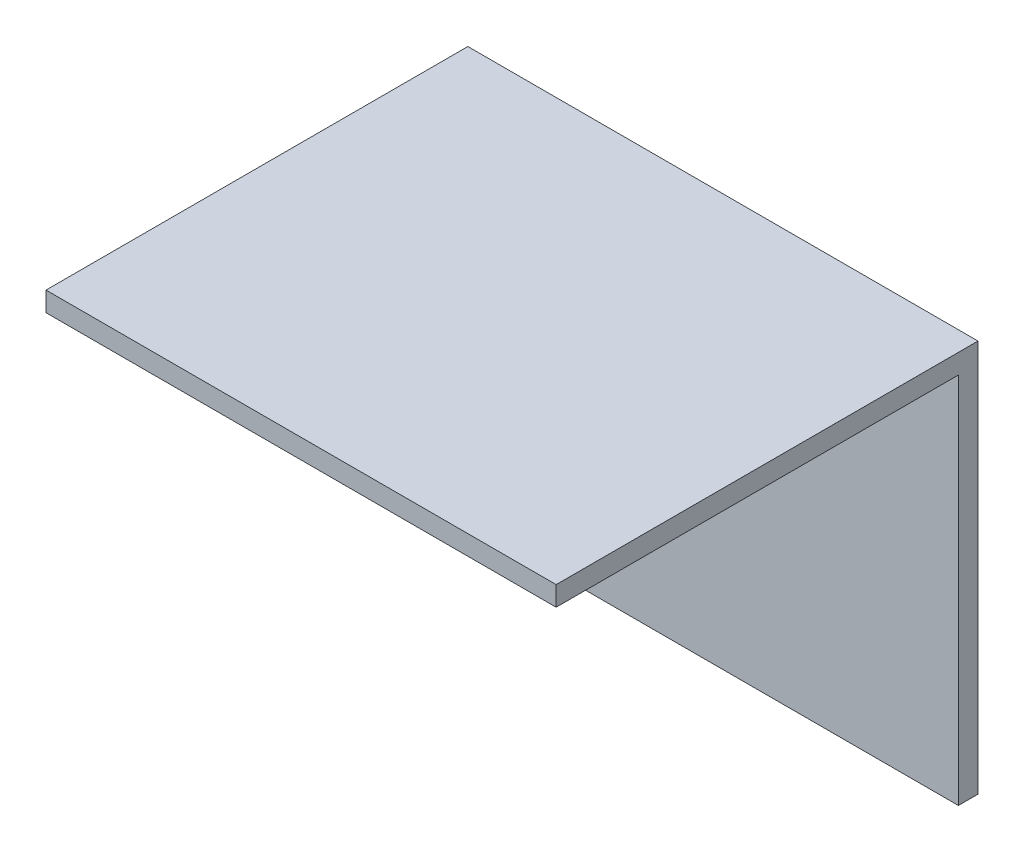
ISO-10303-21;
HEADER;
FILE_DESCRIPTION(('STEP AP214'),'2;1');
FILE_NAME('part.step','',(''),(''),'','','');
FILE_SCHEMA(('AUTOMOTIVE_DESIGN { 1 0 10303 214 1 1 1 1 }'));
ENDSEC;
DATA;
#1=APPLICATION_CONTEXT('core data for automotive mechanical design processes');
#2=APPLICATION_PROTOCOL_DEFINITION('international standard','automotive_design',2000,#1);
#3=PRODUCT_CONTEXT('',#1,'mechanical');
#4=PRODUCT('Part','Part','',(#3));
#5=PRODUCT_RELATED_PRODUCT_CATEGORY('part','',(#4));
#6=PRODUCT_DEFINITION_FORMATION('','',#4);
#7=PRODUCT_DEFINITION_CONTEXT('part definition',#1,'design');
#8=PRODUCT_DEFINITION('design','',#6,#7);
#9=PRODUCT_DEFINITION_SHAPE('','',#8);
#10=(LENGTH_UNIT() NAMED_UNIT(*) SI_UNIT(.MILLI.,.METRE.));
#11=(NAMED_UNIT(*) PLANE_ANGLE_UNIT() SI_UNIT($,.RADIAN.));
#12=(NAMED_UNIT(*) SI_UNIT($,.STERADIAN.) SOLID_ANGLE_UNIT());
#13=UNCERTAINTY_MEASURE_WITH_UNIT(LENGTH_MEASURE(1.E-05),#10,'distance_accuracy_value','');
#14=(GEOMETRIC_REPRESENTATION_CONTEXT(3) GLOBAL_UNCERTAINTY_ASSIGNED_CONTEXT((#13)) GLOBAL_UNIT_ASSIGNED_CONTEXT((#10,
#11,#12)) REPRESENTATION_CONTEXT('',''));
#15=CARTESIAN_POINT('',(0.,0.,0.));
#16=DIRECTION('',(0.,0.,1.));
#17=DIRECTION('',(1.,0.,0.));
#18=AXIS2_PLACEMENT_3D('',#15,#16,#17);
#19=CARTESIAN_POINT('',(26.,-20.,43.));
#20=DIRECTION('',(-1.,0.,0.));
#21=DIRECTION('',(0.,0.,1.));
#22=AXIS2_PLACEMENT_3D('',#19,#20,#21);
#23=PLANE('',#22);
#24=DIRECTION('',(0.,1.,0.));
#25=VECTOR('',#24,1.);
#26=CARTESIAN_POINT('',(26.,-20.,43.));
#27=LINE('',#26,#25);
#28=CARTESIAN_POINT('',(26.,18.,43.));
#29=VERTEX_POINT('',#28);
#30=CARTESIAN_POINT('',(26.,20.,43.));
#31=VERTEX_POINT('',#30);
#32=EDGE_CURVE('E91',#29,#31,#27,.T.);
#33=ORIENTED_EDGE('',*,*,#32,.F.);
#34=DIRECTION('',(0.,0.,-1.));
#35=VECTOR('',#34,1.);
#36=CARTESIAN_POINT('',(26.,18.,43.));
#37=LINE('',#36,#35);
#38=CARTESIAN_POINT('',(26.,18.,2.));
#39=VERTEX_POINT('',#38);
#40=EDGE_CURVE('E115',#29,#39,#37,.T.);
#41=ORIENTED_EDGE('',*,*,#40,.T.);
#42=DIRECTION('',(0.,-1.,0.));
#43=VECTOR('',#42,1.);
#44=CARTESIAN_POINT('',(26.,-20.,2.));
#45=LINE('',#44,#43);
#46=CARTESIAN_POINT('',(26.,-20.,2.));
#47=VERTEX_POINT('',#46);
#48=EDGE_CURVE('E83',#39,#47,#45,.T.);
#49=ORIENTED_EDGE('',*,*,#48,.T.);
#50=DIRECTION('',(0.,0.,-1.));
#51=VECTOR('',#50,1.);
#52=CARTESIAN_POINT('',(26.,-20.,43.));
#53=LINE('',#52,#51);
#54=CARTESIAN_POINT('',(26.,-20.,0.));
#55=VERTEX_POINT('',#54);
#56=EDGE_CURVE('E75',#47,#55,#53,.T.);
#57=ORIENTED_EDGE('',*,*,#56,.T.);
#58=DIRECTION('',(0.,1.,0.));
#59=VECTOR('',#58,1.);
#60=CARTESIAN_POINT('',(26.,-20.,0.));
#61=LINE('',#60,#59);
#62=CARTESIAN_POINT('',(26.,20.,0.));
#63=VERTEX_POINT('',#62);
#64=EDGE_CURVE('E79',#55,#63,#61,.T.);
#65=ORIENTED_EDGE('',*,*,#64,.T.);
#66=DIRECTION('',(0.,0.,-1.));
#67=VECTOR('',#66,1.);
#68=CARTESIAN_POINT('',(26.,20.,43.));
#69=LINE('',#68,#67);
#70=EDGE_CURVE('E43',#31,#63,#69,.T.);
#71=ORIENTED_EDGE('',*,*,#70,.F.);
#72=EDGE_LOOP('',(#33,#41,#49,#57,#65,#71));
#73=FACE_BOUND('',#72,.T.);
#74=ADVANCED_FACE('F35',(#73),#23,.F.);
#75=CARTESIAN_POINT('',(-26.,20.,43.));
#76=DIRECTION('',(0.,-1.,0.));
#77=DIRECTION('',(0.,0.,-1.));
#78=AXIS2_PLACEMENT_3D('',#75,#76,#77);
#79=PLANE('',#78);
#80=DIRECTION('',(-1.,0.,0.));
#81=VECTOR('',#80,1.);
#82=CARTESIAN_POINT('',(-26.,20.,0.));
#83=LINE('',#82,#81);
#84=CARTESIAN_POINT('',(-26.,20.,0.));
#85=VERTEX_POINT('',#84);
#86=EDGE_CURVE('E95',#63,#85,#83,.T.);
#87=ORIENTED_EDGE('',*,*,#86,.T.);
#88=DIRECTION('',(0.,0.,-1.));
#89=VECTOR('',#88,1.);
#90=CARTESIAN_POINT('',(-26.,20.,43.));
#91=LINE('',#90,#89);
#92=CARTESIAN_POINT('',(-26.,20.,43.));
#93=VERTEX_POINT('',#92);
#94=EDGE_CURVE('E108',#93,#85,#91,.T.);
#95=ORIENTED_EDGE('',*,*,#94,.F.);
#96=DIRECTION('',(-1.,0.,0.));
#97=VECTOR('',#96,1.);
#98=CARTESIAN_POINT('',(-26.,20.,43.));
#99=LINE('',#98,#97);
#100=EDGE_CURVE('E51',#31,#93,#99,.T.);
#101=ORIENTED_EDGE('',*,*,#100,.F.);
#102=ORIENTED_EDGE('',*,*,#70,.T.);
#103=EDGE_LOOP('',(#87,#95,#101,#102));
#104=FACE_BOUND('',#103,.T.);
#105=ADVANCED_FACE('F111',(#104),#79,.F.);
#106=CARTESIAN_POINT('',(-26.,-20.,43.));
#107=DIRECTION('',(1.,0.,0.));
#108=DIRECTION('',(0.,0.,-1.));
#109=AXIS2_PLACEMENT_3D('',#106,#107,#108);
#110=PLANE('',#109);
#111=DIRECTION('',(0.,0.,-1.));
#112=VECTOR('',#111,1.);
#113=CARTESIAN_POINT('',(-26.,-20.,43.));
#114=LINE('',#113,#112);
#115=CARTESIAN_POINT('',(-26.,-20.,2.));
#116=VERTEX_POINT('',#115);
#117=CARTESIAN_POINT('',(-26.,-20.,0.));
#118=VERTEX_POINT('',#117);
#119=EDGE_CURVE('E68',#116,#118,#114,.T.);
#120=ORIENTED_EDGE('',*,*,#119,.F.);
#121=DIRECTION('',(0.,-1.,0.));
#122=VECTOR('',#121,1.);
#123=CARTESIAN_POINT('',(-26.,18.,2.));
#124=LINE('',#123,#122);
#125=CARTESIAN_POINT('',(-26.,18.,2.));
#126=VERTEX_POINT('',#125);
#127=EDGE_CURVE('E122',#126,#116,#124,.T.);
#128=ORIENTED_EDGE('',*,*,#127,.F.);
#129=DIRECTION('',(0.,0.,-1.));
#130=VECTOR('',#129,1.);
#131=CARTESIAN_POINT('',(-26.,18.,50.2220480122162));
#132=LINE('',#131,#130);
#133=CARTESIAN_POINT('',(-26.,18.,43.));
#134=VERTEX_POINT('',#133);
#135=EDGE_CURVE('E101',#134,#126,#132,.T.);
#136=ORIENTED_EDGE('',*,*,#135,.F.);
#137=DIRECTION('',(0.,-1.,0.));
#138=VECTOR('',#137,1.);
#139=CARTESIAN_POINT('',(-26.,-20.,43.));
#140=LINE('',#139,#138);
#141=EDGE_CURVE('E84',#93,#134,#140,.T.);
#142=ORIENTED_EDGE('',*,*,#141,.F.);
#143=ORIENTED_EDGE('',*,*,#94,.T.);
#144=DIRECTION('',(0.,-1.,0.));
#145=VECTOR('',#144,1.);
#146=CARTESIAN_POINT('',(-26.,-20.,0.));
#147=LINE('',#146,#145);
#148=EDGE_CURVE('E92',#85,#118,#147,.T.);
#149=ORIENTED_EDGE('',*,*,#148,.T.);
#150=EDGE_LOOP('',(#120,#128,#136,#142,#143,#149));
#151=FACE_BOUND('',#150,.T.);
#152=ADVANCED_FACE('F136',(#151),#110,.F.);
#153=CARTESIAN_POINT('',(-26.,-20.,43.));
#154=DIRECTION('',(0.,1.,0.));
#155=DIRECTION('',(0.,0.,1.));
#156=AXIS2_PLACEMENT_3D('',#153,#154,#155);
#157=PLANE('',#156);
#158=ORIENTED_EDGE('',*,*,#56,.F.);
#159=DIRECTION('',(1.,0.,0.));
#160=VECTOR('',#159,1.);
#161=CARTESIAN_POINT('',(-34.6851779686972,-20.,2.));
#162=LINE('',#161,#160);
#163=EDGE_CURVE('E127',#116,#47,#162,.T.);
#164=ORIENTED_EDGE('',*,*,#163,.F.);
#165=ORIENTED_EDGE('',*,*,#119,.T.);
#166=DIRECTION('',(1.,0.,0.));
#167=VECTOR('',#166,1.);
#168=CARTESIAN_POINT('',(-26.,-20.,0.));
#169=LINE('',#168,#167);
#170=EDGE_CURVE('E87',#118,#55,#169,.T.);
#171=ORIENTED_EDGE('',*,*,#170,.T.);
#172=EDGE_LOOP('',(#158,#164,#165,#171));
#173=FACE_BOUND('',#172,.T.);
#174=ADVANCED_FACE('F88',(#173),#157,.F.);
#175=CARTESIAN_POINT('',(0.,0.,43.));
#176=DIRECTION('',(0.,0.,-1.));
#177=DIRECTION('',(-1.,0.,0.));
#178=AXIS2_PLACEMENT_3D('',#175,#176,#177);
#179=PLANE('',#178);
#180=DIRECTION('',(1.,0.,0.));
#181=VECTOR('',#180,1.);
#182=CARTESIAN_POINT('',(0.,18.,43.));
#183=LINE('',#182,#181);
#184=EDGE_CURVE('E11',#134,#29,#183,.T.);
#185=ORIENTED_EDGE('',*,*,#184,.T.);
#186=ORIENTED_EDGE('',*,*,#32,.T.);
#187=ORIENTED_EDGE('',*,*,#100,.T.);
#188=ORIENTED_EDGE('',*,*,#141,.T.);
#189=EDGE_LOOP('',(#185,#186,#187,#188));
#190=FACE_BOUND('',#189,.T.);
#191=ADVANCED_FACE('F139',(#190),#179,.F.);
#192=CARTESIAN_POINT('',(0.,0.,0.));
#193=DIRECTION('',(0.,0.,-1.));
#194=DIRECTION('',(-1.,0.,0.));
#195=AXIS2_PLACEMENT_3D('',#192,#193,#194);
#196=PLANE('',#195);
#197=ORIENTED_EDGE('',*,*,#64,.F.);
#198=ORIENTED_EDGE('',*,*,#170,.F.);
#199=ORIENTED_EDGE('',*,*,#148,.F.);
#200=ORIENTED_EDGE('',*,*,#86,.F.);
#201=EDGE_LOOP('',(#197,#198,#199,#200));
#202=FACE_BOUND('',#201,.T.);
#203=ADVANCED_FACE('F94',(#202),#196,.T.);
#204=CARTESIAN_POINT('',(24.,18.,50.2220480122162));
#205=DIRECTION('',(0.,1.,0.));
#206=DIRECTION('',(0.,0.,1.));
#207=AXIS2_PLACEMENT_3D('',#204,#205,#206);
#208=PLANE('',#207);
#209=ORIENTED_EDGE('',*,*,#135,.T.);
#210=DIRECTION('',(-1.,0.,0.));
#211=VECTOR('',#210,1.);
#212=CARTESIAN_POINT('',(24.,18.,2.));
#213=LINE('',#212,#211);
#214=EDGE_CURVE('E97',#39,#126,#213,.T.);
#215=ORIENTED_EDGE('',*,*,#214,.F.);
#216=ORIENTED_EDGE('',*,*,#40,.F.);
#217=ORIENTED_EDGE('',*,*,#184,.F.);
#218=EDGE_LOOP('',(#209,#215,#216,#217));
#219=FACE_BOUND('',#218,.T.);
#220=ADVANCED_FACE('F145',(#219),#208,.F.);
#221=CARTESIAN_POINT('',(24.,18.,2.));
#222=DIRECTION('',(0.,0.,-1.));
#223=DIRECTION('',(-1.,0.,0.));
#224=AXIS2_PLACEMENT_3D('',#221,#222,#223);
#225=PLANE('',#224);
#226=ORIENTED_EDGE('',*,*,#127,.T.);
#227=ORIENTED_EDGE('',*,*,#163,.T.);
#228=ORIENTED_EDGE('',*,*,#48,.F.);
#229=ORIENTED_EDGE('',*,*,#214,.T.);
#230=EDGE_LOOP('',(#226,#227,#228,#229));
#231=FACE_BOUND('',#230,.T.);
#232=ADVANCED_FACE('F130',(#231),#225,.F.);
#233=CLOSED_SHELL('',(#74,#105,#152,#174,#191,#203,#220,#232));
#234=MANIFOLD_SOLID_BREP('B2',#233);
#235=ADVANCED_BREP_SHAPE_REPRESENTATION('',(#18,#234),#14);
#236=SHAPE_DEFINITION_REPRESENTATION(#9,#235);
ENDSEC;
END-ISO-10303-21;
